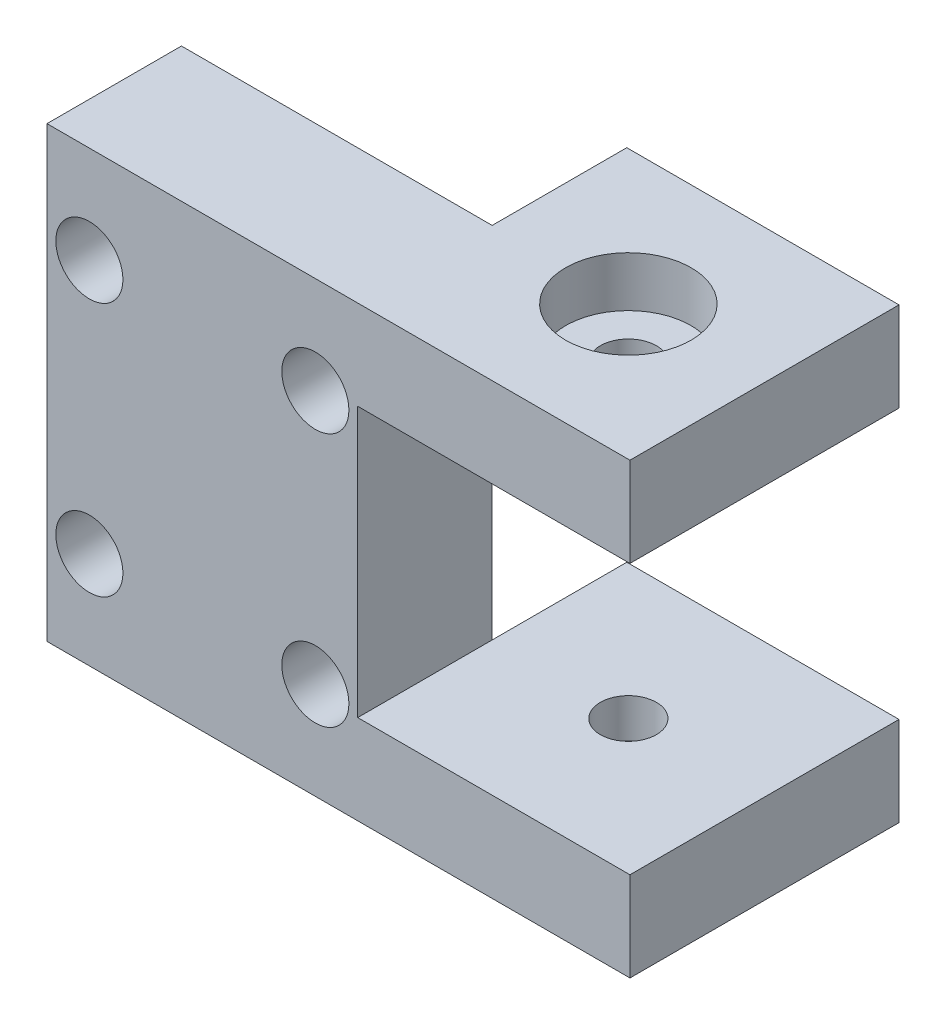
ISO-10303-21;
HEADER;
FILE_DESCRIPTION(('STEP AP214'),'2;1');
FILE_NAME('part.step','',(''),(''),'','','');
FILE_SCHEMA(('AUTOMOTIVE_DESIGN { 1 0 10303 214 1 1 1 1 }'));
ENDSEC;
DATA;
#1=APPLICATION_CONTEXT('core data for automotive mechanical design processes');
#2=APPLICATION_PROTOCOL_DEFINITION('international standard','automotive_design',2000,#1);
#3=PRODUCT_CONTEXT('',#1,'mechanical');
#4=PRODUCT('Part','Part','',(#3));
#5=PRODUCT_RELATED_PRODUCT_CATEGORY('part','',(#4));
#6=PRODUCT_DEFINITION_FORMATION('','',#4);
#7=PRODUCT_DEFINITION_CONTEXT('part definition',#1,'design');
#8=PRODUCT_DEFINITION('design','',#6,#7);
#9=PRODUCT_DEFINITION_SHAPE('','',#8);
#10=(LENGTH_UNIT() NAMED_UNIT(*) SI_UNIT(.MILLI.,.METRE.));
#11=(NAMED_UNIT(*) PLANE_ANGLE_UNIT() SI_UNIT($,.RADIAN.));
#12=(NAMED_UNIT(*) SI_UNIT($,.STERADIAN.) SOLID_ANGLE_UNIT());
#13=UNCERTAINTY_MEASURE_WITH_UNIT(LENGTH_MEASURE(1.E-05),#10,'distance_accuracy_value','');
#14=(GEOMETRIC_REPRESENTATION_CONTEXT(3) GLOBAL_UNCERTAINTY_ASSIGNED_CONTEXT((#13)) GLOBAL_UNIT_ASSIGNED_CONTEXT((#10,
#11,#12)) REPRESENTATION_CONTEXT('',''));
#15=CARTESIAN_POINT('',(0.,0.,0.));
#16=DIRECTION('',(0.,0.,1.));
#17=DIRECTION('',(1.,0.,0.));
#18=AXIS2_PLACEMENT_3D('',#15,#16,#17);
#19=CARTESIAN_POINT('',(-187.450000000001,17.9999999999998,19.038019346602));
#20=DIRECTION('',(0.,0.,-1.));
#21=DIRECTION('',(-1.,0.,0.));
#22=AXIS2_PLACEMENT_3D('',#19,#20,#21);
#23=CYLINDRICAL_SURFACE('',#22,2.65000000000001);
#24=CARTESIAN_POINT('',(-187.45,18.,0.));
#25=DIRECTION('',(0.,0.,1.));
#26=DIRECTION('',(1.,0.,0.));
#27=AXIS2_PLACEMENT_3D('',#24,#25,#26);
#28=CIRCLE('',#27,2.65000000000001);
#29=CARTESIAN_POINT('',(-184.8,18.,0.));
#30=VERTEX_POINT('',#29);
#31=EDGE_CURVE('E423',#30,#30,#28,.T.);
#32=ORIENTED_EDGE('',*,*,#31,.F.);
#33=EDGE_LOOP('',(#32));
#34=FACE_BOUND('',#33,.T.);
#35=CARTESIAN_POINT('',(-187.450000000001,17.9999999999998,6.35000000000006));
#36=DIRECTION('',(0.,0.,1.));
#37=DIRECTION('',(1.,0.,0.));
#38=AXIS2_PLACEMENT_3D('',#35,#36,#37);
#39=CIRCLE('',#38,2.65000000000001);
#40=CARTESIAN_POINT('',(-184.8,17.9999999999998,6.35000000000006));
#41=VERTEX_POINT('',#40);
#42=EDGE_CURVE('E632',#41,#41,#39,.F.);
#43=ORIENTED_EDGE('',*,*,#42,.F.);
#44=EDGE_LOOP('',(#43));
#45=FACE_BOUND('',#44,.T.);
#46=ADVANCED_FACE('F45',(#34,#45),#23,.F.);
#47=CARTESIAN_POINT('',(-155.450000000006,17.9999999999986,19.038019346603));
#48=DIRECTION('',(0.,0.,-1.));
#49=DIRECTION('',(-1.,0.,0.));
#50=AXIS2_PLACEMENT_3D('',#47,#48,#49);
#51=CYLINDRICAL_SURFACE('',#50,2.65000000000001);
#52=CARTESIAN_POINT('',(-155.45,17.9999999999999,0.));
#53=DIRECTION('',(0.,0.,1.));
#54=DIRECTION('',(1.,0.,0.));
#55=AXIS2_PLACEMENT_3D('',#52,#53,#54);
#56=CIRCLE('',#55,2.65000000000001);
#57=CARTESIAN_POINT('',(-152.8,17.9999999999999,0.));
#58=VERTEX_POINT('',#57);
#59=EDGE_CURVE('E421',#58,#58,#56,.T.);
#60=ORIENTED_EDGE('',*,*,#59,.F.);
#61=EDGE_LOOP('',(#60));
#62=FACE_BOUND('',#61,.T.);
#63=CARTESIAN_POINT('',(-155.450000000002,17.9999999999994,6.35000000000033));
#64=DIRECTION('',(0.,0.,1.));
#65=DIRECTION('',(1.,0.,0.));
#66=AXIS2_PLACEMENT_3D('',#63,#64,#65);
#67=CIRCLE('',#66,2.65000000000001);
#68=CARTESIAN_POINT('',(-152.800000000002,17.9999999999994,6.35000000000032));
#69=VERTEX_POINT('',#68);
#70=EDGE_CURVE('E647',#69,#69,#67,.F.);
#71=ORIENTED_EDGE('',*,*,#70,.F.);
#72=EDGE_LOOP('',(#71));
#73=FACE_BOUND('',#72,.T.);
#74=ADVANCED_FACE('F360',(#62,#73),#51,.F.);
#75=CARTESIAN_POINT('',(-155.450000000006,-18.0000000000013,19.0380193466032));
#76=DIRECTION('',(0.,0.,-1.));
#77=DIRECTION('',(-1.,0.,0.));
#78=AXIS2_PLACEMENT_3D('',#75,#76,#77);
#79=CYLINDRICAL_SURFACE('',#78,2.65000000000001);
#80=CARTESIAN_POINT('',(-155.450000000006,-18.0000000000012,6.52256026967279E-13));
#81=DIRECTION('',(0.,0.,1.));
#82=DIRECTION('',(1.,0.,0.));
#83=AXIS2_PLACEMENT_3D('',#80,#81,#82);
#84=CIRCLE('',#83,2.65000000000001);
#85=CARTESIAN_POINT('',(-152.800000000006,-18.0000000000012,6.51814713314991E-13));
#86=VERTEX_POINT('',#85);
#87=EDGE_CURVE('E417',#86,#86,#84,.T.);
#88=ORIENTED_EDGE('',*,*,#87,.F.);
#89=EDGE_LOOP('',(#88));
#90=FACE_BOUND('',#89,.T.);
#91=CARTESIAN_POINT('',(-155.450000000006,-18.0000000000012,6.35000000000091));
#92=DIRECTION('',(0.,0.,1.));
#93=DIRECTION('',(1.,0.,0.));
#94=AXIS2_PLACEMENT_3D('',#91,#92,#93);
#95=CIRCLE('',#94,2.65000000000001);
#96=CARTESIAN_POINT('',(-152.800000000006,-18.0000000000012,6.35000000000091));
#97=VERTEX_POINT('',#96);
#98=EDGE_CURVE('E662',#97,#97,#95,.F.);
#99=ORIENTED_EDGE('',*,*,#98,.F.);
#100=EDGE_LOOP('',(#99));
#101=FACE_BOUND('',#100,.T.);
#102=ADVANCED_FACE('F367',(#90,#101),#79,.F.);
#103=CARTESIAN_POINT('',(-187.450000000001,-18.0000000000002,19.038019346602));
#104=DIRECTION('',(0.,0.,-1.));
#105=DIRECTION('',(-1.,0.,0.));
#106=AXIS2_PLACEMENT_3D('',#103,#104,#105);
#107=CYLINDRICAL_SURFACE('',#106,2.65000000000001);
#108=CARTESIAN_POINT('',(-187.45,-18.,0.));
#109=DIRECTION('',(0.,0.,1.));
#110=DIRECTION('',(1.,0.,0.));
#111=AXIS2_PLACEMENT_3D('',#108,#109,#110);
#112=CIRCLE('',#111,2.65000000000001);
#113=CARTESIAN_POINT('',(-184.8,-18.,0.));
#114=VERTEX_POINT('',#113);
#115=EDGE_CURVE('E413',#114,#114,#112,.T.);
#116=ORIENTED_EDGE('',*,*,#115,.F.);
#117=EDGE_LOOP('',(#116));
#118=FACE_BOUND('',#117,.T.);
#119=CARTESIAN_POINT('',(-187.45,-18.,6.35));
#120=DIRECTION('',(0.,0.,1.));
#121=DIRECTION('',(1.,0.,0.));
#122=AXIS2_PLACEMENT_3D('',#119,#120,#121);
#123=CIRCLE('',#122,2.65000000000001);
#124=CARTESIAN_POINT('',(-184.8,-18.,6.35));
#125=VERTEX_POINT('',#124);
#126=EDGE_CURVE('E649',#125,#125,#123,.F.);
#127=ORIENTED_EDGE('',*,*,#126,.F.);
#128=EDGE_LOOP('',(#127));
#129=FACE_BOUND('',#128,.T.);
#130=ADVANCED_FACE('F374',(#118,#129),#107,.F.);
#131=CARTESIAN_POINT('',(-130.175000000001,-31.7500000000001,-0.0119806533978584));
#132=DIRECTION('',(0.,1.,0.));
#133=DIRECTION('',(0.,0.,1.));
#134=AXIS2_PLACEMENT_3D('',#131,#132,#133);
#135=CYLINDRICAL_SURFACE('',#134,3.96874999999999);
#136=CARTESIAN_POINT('',(-130.175000000001,19.0888193466016,-0.0119806533979607));
#137=DIRECTION('',(0.,1.,0.));
#138=DIRECTION('',(0.,0.,1.));
#139=AXIS2_PLACEMENT_3D('',#136,#137,#138);
#140=CIRCLE('',#139,3.96874999999999);
#141=CARTESIAN_POINT('',(-130.175000000001,19.0888193466016,3.95676934660203));
#142=VERTEX_POINT('',#141);
#143=EDGE_CURVE('E189',#142,#142,#140,.T.);
#144=ORIENTED_EDGE('',*,*,#143,.F.);
#145=EDGE_LOOP('',(#144));
#146=FACE_BOUND('',#145,.T.);
#147=CARTESIAN_POINT('',(-130.175000000001,24.6463393466016,-0.0119806533979572));
#148=DIRECTION('',(0.,1.,0.));
#149=DIRECTION('',(0.,0.,1.));
#150=AXIS2_PLACEMENT_3D('',#147,#148,#149);
#151=CIRCLE('',#150,3.96874999999999);
#152=CARTESIAN_POINT('',(-130.175000000001,24.6463393466016,3.95676934660203));
#153=VERTEX_POINT('',#152);
#154=EDGE_CURVE('E212',#153,#153,#151,.F.);
#155=ORIENTED_EDGE('',*,*,#154,.F.);
#156=EDGE_LOOP('',(#155));
#157=FACE_BOUND('',#156,.T.);
#158=ADVANCED_FACE('F396',(#146,#157),#135,.F.);
#159=CARTESIAN_POINT('',(0.,-31.75,19.0380193466019));
#160=DIRECTION('',(0.,1.,0.));
#161=DIRECTION('',(0.,0.,1.));
#162=AXIS2_PLACEMENT_3D('',#159,#160,#161);
#163=PLANE('',#162);
#164=DIRECTION('',(1.,0.,0.));
#165=VECTOR('',#164,1.);
#166=CARTESIAN_POINT('',(0.,-31.75,0.));
#167=LINE('',#166,#165);
#168=CARTESIAN_POINT('',(-193.450000000001,-31.7500000000001,0.));
#169=VERTEX_POINT('',#168);
#170=CARTESIAN_POINT('',(-149.450000000004,-31.7500000000007,4.77048955893622E-13));
#171=VERTEX_POINT('',#170);
#172=EDGE_CURVE('E167',#169,#171,#167,.T.);
#173=ORIENTED_EDGE('',*,*,#172,.T.);
#174=DIRECTION('',(0.,0.,1.));
#175=VECTOR('',#174,1.);
#176=CARTESIAN_POINT('',(-149.45,-31.75,-97.7379340684195));
#177=LINE('',#176,#175);
#178=CARTESIAN_POINT('',(-149.45,-31.7500000000001,-19.061980653398));
#179=VERTEX_POINT('',#178);
#180=EDGE_CURVE('E63',#179,#171,#177,.T.);
#181=ORIENTED_EDGE('',*,*,#180,.F.);
#182=DIRECTION('',(-1.,0.,0.));
#183=VECTOR('',#182,1.);
#184=CARTESIAN_POINT('',(0.,-31.75,-19.0619806533981));
#185=LINE('',#184,#183);
#186=CARTESIAN_POINT('',(-110.900000000001,-31.7500000000003,-19.061980653398));
#187=VERTEX_POINT('',#186);
#188=EDGE_CURVE('E138',#187,#179,#185,.T.);
#189=ORIENTED_EDGE('',*,*,#188,.F.);
#190=DIRECTION('',(0.,0.,-1.));
#191=VECTOR('',#190,1.);
#192=CARTESIAN_POINT('',(-110.900000000001,-31.7500000000002,19.0380193466022));
#193=LINE('',#192,#191);
#194=CARTESIAN_POINT('',(-110.900000000001,-31.7500000000002,19.0380193466022));
#195=VERTEX_POINT('',#194);
#196=EDGE_CURVE('E132',#195,#187,#193,.T.);
#197=ORIENTED_EDGE('',*,*,#196,.F.);
#198=DIRECTION('',(1.,0.,0.));
#199=VECTOR('',#198,1.);
#200=CARTESIAN_POINT('',(0.,-31.75,19.0380193466019));
#201=LINE('',#200,#199);
#202=CARTESIAN_POINT('',(-193.450000000001,-31.7500000000002,19.038019346602));
#203=VERTEX_POINT('',#202);
#204=EDGE_CURVE('E116',#203,#195,#201,.T.);
#205=ORIENTED_EDGE('',*,*,#204,.F.);
#206=DIRECTION('',(0.,0.,-1.));
#207=VECTOR('',#206,1.);
#208=CARTESIAN_POINT('',(-193.450000000001,-31.7500000000002,19.038019346602));
#209=LINE('',#208,#207);
#210=EDGE_CURVE('E143',#203,#169,#209,.T.);
#211=ORIENTED_EDGE('',*,*,#210,.T.);
#212=EDGE_LOOP('',(#173,#181,#189,#197,#205,#211));
#213=FACE_BOUND('',#212,.T.);
#214=CARTESIAN_POINT('',(-130.175000000001,-31.7500000000001,-0.0119806533978584));
#215=DIRECTION('',(0.,1.,0.));
#216=DIRECTION('',(0.,0.,1.));
#217=AXIS2_PLACEMENT_3D('',#214,#215,#216);
#218=CIRCLE('',#217,8.88999999999999);
#219=CARTESIAN_POINT('',(-130.175000000001,-31.7500000000001,8.87801934660213));
#220=VERTEX_POINT('',#219);
#221=EDGE_CURVE('E49',#220,#220,#218,.F.);
#222=ORIENTED_EDGE('',*,*,#221,.F.);
#223=EDGE_LOOP('',(#222));
#224=FACE_BOUND('',#223,.T.);
#225=ADVANCED_FACE('F134',(#213,#224),#163,.F.);
#226=CARTESIAN_POINT('',(-149.450000000006,-1.35048222604794E-12,19.0380193466033));
#227=DIRECTION('',(1.,0.,0.));
#228=DIRECTION('',(0.,0.,-1.));
#229=AXIS2_PLACEMENT_3D('',#226,#227,#228);
#230=PLANE('',#229);
#231=DIRECTION('',(0.,-1.,0.));
#232=VECTOR('',#231,1.);
#233=CARTESIAN_POINT('',(-149.450000000003,-5.62375666868231E-13,3.20815422838461E-13));
#234=LINE('',#233,#232);
#235=CARTESIAN_POINT('',(-149.450000000006,19.0888193466006,5.41233724504764E-13));
#236=VERTEX_POINT('',#235);
#237=CARTESIAN_POINT('',(-149.450000000004,-19.0888193466026,5.36896915814822E-13));
#238=VERTEX_POINT('',#237);
#239=EDGE_CURVE('E156',#236,#238,#234,.T.);
#240=ORIENTED_EDGE('',*,*,#239,.F.);
#241=DIRECTION('',(0.,0.,-1.));
#242=VECTOR('',#241,1.);
#243=CARTESIAN_POINT('',(-149.450000000001,19.0888193466015,19.0380193466022));
#244=LINE('',#243,#242);
#245=CARTESIAN_POINT('',(-149.450000000001,19.0888193466015,19.0380193466022));
#246=VERTEX_POINT('',#245);
#247=EDGE_CURVE('E12',#246,#236,#244,.T.);
#248=ORIENTED_EDGE('',*,*,#247,.F.);
#249=DIRECTION('',(0.,-1.,0.));
#250=VECTOR('',#249,1.);
#251=CARTESIAN_POINT('',(-149.450000000006,-1.35048222604794E-12,19.0380193466033));
#252=LINE('',#251,#250);
#253=CARTESIAN_POINT('',(-149.450000000006,-19.088819346603,19.0380193466033));
#254=VERTEX_POINT('',#253);
#255=EDGE_CURVE('E170',#246,#254,#252,.T.);
#256=ORIENTED_EDGE('',*,*,#255,.T.);
#257=DIRECTION('',(0.,0.,-1.));
#258=VECTOR('',#257,1.);
#259=CARTESIAN_POINT('',(-149.450000000006,-19.088819346603,19.0380193466033));
#260=LINE('',#259,#258);
#261=EDGE_CURVE('E72',#254,#238,#260,.T.);
#262=ORIENTED_EDGE('',*,*,#261,.T.);
#263=EDGE_LOOP('',(#240,#248,#256,#262));
#264=FACE_BOUND('',#263,.T.);
#265=ADVANCED_FACE('F47',(#264),#230,.T.);
#266=CARTESIAN_POINT('',(0.,19.0888193466018,19.0380193466019));
#267=DIRECTION('',(0.,1.,0.));
#268=DIRECTION('',(0.,0.,1.));
#269=AXIS2_PLACEMENT_3D('',#266,#267,#268);
#270=PLANE('',#269);
#271=ORIENTED_EDGE('',*,*,#143,.T.);
#272=EDGE_LOOP('',(#271));
#273=FACE_BOUND('',#272,.T.);
#274=ORIENTED_EDGE('',*,*,#247,.T.);
#275=DIRECTION('',(0.,0.,1.));
#276=VECTOR('',#275,1.);
#277=CARTESIAN_POINT('',(-149.450000000001,19.0888193466016,-97.7379340684197));
#278=LINE('',#277,#276);
#279=CARTESIAN_POINT('',(-149.450000000003,19.0888193466013,-19.061980653398));
#280=VERTEX_POINT('',#279);
#281=EDGE_CURVE('E235',#280,#236,#278,.T.);
#282=ORIENTED_EDGE('',*,*,#281,.F.);
#283=DIRECTION('',(-1.,0.,0.));
#284=VECTOR('',#283,1.);
#285=CARTESIAN_POINT('',(0.,19.0888193466018,-19.0619806533981));
#286=LINE('',#285,#284);
#287=CARTESIAN_POINT('',(-110.900000000002,19.0888193466015,-19.0619806533981));
#288=VERTEX_POINT('',#287);
#289=EDGE_CURVE('E221',#288,#280,#286,.T.);
#290=ORIENTED_EDGE('',*,*,#289,.F.);
#291=DIRECTION('',(0.,0.,-1.));
#292=VECTOR('',#291,1.);
#293=CARTESIAN_POINT('',(-110.900000000005,19.0888193466006,19.0380193466028));
#294=LINE('',#293,#292);
#295=CARTESIAN_POINT('',(-110.900000000005,19.0888193466006,19.0380193466028));
#296=VERTEX_POINT('',#295);
#297=EDGE_CURVE('E55',#296,#288,#294,.T.);
#298=ORIENTED_EDGE('',*,*,#297,.F.);
#299=DIRECTION('',(1.,0.,0.));
#300=VECTOR('',#299,1.);
#301=CARTESIAN_POINT('',(0.,19.0888193466018,19.0380193466019));
#302=LINE('',#301,#300);
#303=EDGE_CURVE('E265',#246,#296,#302,.T.);
#304=ORIENTED_EDGE('',*,*,#303,.F.);
#305=EDGE_LOOP('',(#274,#282,#290,#298,#304));
#306=FACE_BOUND('',#305,.T.);
#307=ADVANCED_FACE('F320',(#273,#306),#270,.F.);
#308=CARTESIAN_POINT('',(-110.900000000002,4.58660887048268E-12,19.038019346602));
#309=DIRECTION('',(1.,0.,0.));
#310=DIRECTION('',(0.,1.,0.));
#311=AXIS2_PLACEMENT_3D('',#308,#309,#310);
#312=PLANE('',#311);
#313=ORIENTED_EDGE('',*,*,#297,.T.);
#314=DIRECTION('',(0.,1.,0.));
#315=VECTOR('',#314,1.);
#316=CARTESIAN_POINT('',(-110.900000000002,4.45997405673637E-12,-19.0619806533979));
#317=LINE('',#316,#315);
#318=CARTESIAN_POINT('',(-110.9,31.7499999999999,-19.061980653398));
#319=VERTEX_POINT('',#318);
#320=EDGE_CURVE('E161',#288,#319,#317,.T.);
#321=ORIENTED_EDGE('',*,*,#320,.T.);
#322=DIRECTION('',(0.,0.,-1.));
#323=VECTOR('',#322,1.);
#324=CARTESIAN_POINT('',(-110.900000000004,31.7499999999987,19.0380193466028));
#325=LINE('',#324,#323);
#326=CARTESIAN_POINT('',(-110.900000000004,31.7499999999987,19.0380193466028));
#327=VERTEX_POINT('',#326);
#328=EDGE_CURVE('E180',#327,#319,#325,.T.);
#329=ORIENTED_EDGE('',*,*,#328,.F.);
#330=DIRECTION('',(0.,-1.,0.));
#331=VECTOR('',#330,1.);
#332=CARTESIAN_POINT('',(-110.900000000002,4.58660887048268E-12,19.038019346602));
#333=LINE('',#332,#331);
#334=EDGE_CURVE('E268',#327,#296,#333,.T.);
#335=ORIENTED_EDGE('',*,*,#334,.T.);
#336=EDGE_LOOP('',(#313,#321,#329,#335));
#337=FACE_BOUND('',#336,.T.);
#338=ADVANCED_FACE('F309',(#337),#312,.T.);
#339=CARTESIAN_POINT('',(0.,31.75,19.0380193466019));
#340=DIRECTION('',(0.,1.,0.));
#341=DIRECTION('',(0.,0.,1.));
#342=AXIS2_PLACEMENT_3D('',#339,#340,#341);
#343=PLANE('',#342);
#344=CARTESIAN_POINT('',(-130.175000000001,31.7499999999998,-0.0119806533979624));
#345=DIRECTION('',(0.,1.,0.));
#346=DIRECTION('',(0.,0.,1.));
#347=AXIS2_PLACEMENT_3D('',#344,#345,#346);
#348=CIRCLE('',#347,8.88999999999999);
#349=CARTESIAN_POINT('',(-130.175000000001,31.7499999999998,8.87801934660203));
#350=VERTEX_POINT('',#349);
#351=EDGE_CURVE('E425',#350,#350,#348,.T.);
#352=ORIENTED_EDGE('',*,*,#351,.F.);
#353=EDGE_LOOP('',(#352));
#354=FACE_BOUND('',#353,.T.);
#355=DIRECTION('',(1.,0.,0.));
#356=VECTOR('',#355,1.);
#357=CARTESIAN_POINT('',(0.,31.75,0.));
#358=LINE('',#357,#356);
#359=CARTESIAN_POINT('',(-193.450000000001,31.7499999999996,0.));
#360=VERTEX_POINT('',#359);
#361=CARTESIAN_POINT('',(-149.450000000006,31.7499999999986,4.09394740330526E-13));
#362=VERTEX_POINT('',#361);
#363=EDGE_CURVE('E160',#360,#362,#358,.T.);
#364=ORIENTED_EDGE('',*,*,#363,.F.);
#365=DIRECTION('',(0.,0.,-1.));
#366=VECTOR('',#365,1.);
#367=CARTESIAN_POINT('',(-193.450000000001,31.7499999999998,19.0380193466021));
#368=LINE('',#367,#366);
#369=CARTESIAN_POINT('',(-193.450000000001,31.7499999999998,19.0380193466021));
#370=VERTEX_POINT('',#369);
#371=EDGE_CURVE('E177',#370,#360,#368,.T.);
#372=ORIENTED_EDGE('',*,*,#371,.F.);
#373=DIRECTION('',(1.,0.,0.));
#374=VECTOR('',#373,1.);
#375=CARTESIAN_POINT('',(0.,31.75,19.0380193466019));
#376=LINE('',#375,#374);
#377=EDGE_CURVE('E272',#370,#327,#376,.T.);
#378=ORIENTED_EDGE('',*,*,#377,.T.);
#379=ORIENTED_EDGE('',*,*,#328,.T.);
#380=DIRECTION('',(-1.,0.,0.));
#381=VECTOR('',#380,1.);
#382=CARTESIAN_POINT('',(0.,31.75,-19.0619806533981));
#383=LINE('',#382,#381);
#384=CARTESIAN_POINT('',(-149.450000000001,31.7499999999996,-19.061980653398));
#385=VERTEX_POINT('',#384);
#386=EDGE_CURVE('E222',#319,#385,#383,.T.);
#387=ORIENTED_EDGE('',*,*,#386,.T.);
#388=DIRECTION('',(0.,0.,1.));
#389=VECTOR('',#388,1.);
#390=CARTESIAN_POINT('',(-149.45,31.7499999999998,-97.7379340684196));
#391=LINE('',#390,#389);
#392=EDGE_CURVE('E233',#385,#362,#391,.T.);
#393=ORIENTED_EDGE('',*,*,#392,.T.);
#394=EDGE_LOOP('',(#364,#372,#378,#379,#387,#393));
#395=FACE_BOUND('',#394,.T.);
#396=ADVANCED_FACE('F303',(#354,#395),#343,.T.);
#397=CARTESIAN_POINT('',(-193.450000000002,-6.58327559133198E-13,19.0380193466024));
#398=DIRECTION('',(1.,0.,0.));
#399=DIRECTION('',(0.,0.,-1.));
#400=AXIS2_PLACEMENT_3D('',#397,#398,#399);
#401=PLANE('',#400);
#402=DIRECTION('',(0.,-1.,0.));
#403=VECTOR('',#402,1.);
#404=CARTESIAN_POINT('',(-193.45,-1.26634813746307E-13,0.));
#405=LINE('',#404,#403);
#406=EDGE_CURVE('E91',#360,#169,#405,.T.);
#407=ORIENTED_EDGE('',*,*,#406,.T.);
#408=ORIENTED_EDGE('',*,*,#210,.F.);
#409=DIRECTION('',(0.,-1.,0.));
#410=VECTOR('',#409,1.);
#411=CARTESIAN_POINT('',(-193.450000000002,-6.58327559133198E-13,19.0380193466024));
#412=LINE('',#411,#410);
#413=EDGE_CURVE('E126',#370,#203,#412,.T.);
#414=ORIENTED_EDGE('',*,*,#413,.F.);
#415=ORIENTED_EDGE('',*,*,#371,.T.);
#416=EDGE_LOOP('',(#407,#408,#414,#415));
#417=FACE_BOUND('',#416,.T.);
#418=ADVANCED_FACE('F356',(#417),#401,.F.);
#419=CARTESIAN_POINT('',(-110.900000000006,-5.84948756099379E-12,19.0380193466032));
#420=DIRECTION('',(-1.,0.,0.));
#421=DIRECTION('',(0.,-1.,0.));
#422=AXIS2_PLACEMENT_3D('',#419,#420,#421);
#423=PLANE('',#422);
#424=ORIENTED_EDGE('',*,*,#196,.T.);
#425=DIRECTION('',(0.,-1.,0.));
#426=VECTOR('',#425,1.);
#427=CARTESIAN_POINT('',(-110.900000000001,-4.79477568759989E-12,-19.0619806533981));
#428=LINE('',#427,#426);
#429=CARTESIAN_POINT('',(-110.900000000001,-19.088819346602,-19.061980653398));
#430=VERTEX_POINT('',#429);
#431=EDGE_CURVE('E234',#430,#187,#428,.T.);
#432=ORIENTED_EDGE('',*,*,#431,.F.);
#433=DIRECTION('',(0.,0.,-1.));
#434=VECTOR('',#433,1.);
#435=CARTESIAN_POINT('',(-110.900000000002,-19.0888193466023,19.0380193466023));
#436=LINE('',#435,#434);
#437=CARTESIAN_POINT('',(-110.900000000002,-19.0888193466023,19.0380193466023));
#438=VERTEX_POINT('',#437);
#439=EDGE_CURVE('E144',#438,#430,#436,.T.);
#440=ORIENTED_EDGE('',*,*,#439,.F.);
#441=DIRECTION('',(0.,1.,0.));
#442=VECTOR('',#441,1.);
#443=CARTESIAN_POINT('',(-110.900000000006,-5.84948756099379E-12,19.0380193466032));
#444=LINE('',#443,#442);
#445=EDGE_CURVE('E122',#195,#438,#444,.T.);
#446=ORIENTED_EDGE('',*,*,#445,.F.);
#447=EDGE_LOOP('',(#424,#432,#440,#446));
#448=FACE_BOUND('',#447,.T.);
#449=ADVANCED_FACE('F146',(#448),#423,.F.);
#450=CARTESIAN_POINT('',(0.,-19.0888193466018,19.0380193466019));
#451=DIRECTION('',(0.,1.,0.));
#452=DIRECTION('',(0.,0.,1.));
#453=AXIS2_PLACEMENT_3D('',#450,#451,#452);
#454=PLANE('',#453);
#455=CARTESIAN_POINT('',(-130.175000000001,-19.0888193466019,-0.0119806533979953));
#456=DIRECTION('',(0.,1.,0.));
#457=DIRECTION('',(0.,0.,1.));
#458=AXIS2_PLACEMENT_3D('',#455,#456,#457);
#459=CIRCLE('',#458,3.96874999999999);
#460=CARTESIAN_POINT('',(-130.175000000001,-19.0888193466019,3.956769346602));
#461=VERTEX_POINT('',#460);
#462=EDGE_CURVE('E186',#461,#461,#459,.T.);
#463=ORIENTED_EDGE('',*,*,#462,.F.);
#464=EDGE_LOOP('',(#463));
#465=FACE_BOUND('',#464,.T.);
#466=ORIENTED_EDGE('',*,*,#439,.T.);
#467=DIRECTION('',(-1.,0.,0.));
#468=VECTOR('',#467,1.);
#469=CARTESIAN_POINT('',(0.,-19.0888193466019,-19.0619806533981));
#470=LINE('',#469,#468);
#471=CARTESIAN_POINT('',(-149.450000000001,-19.0888193466021,-19.061980653398));
#472=VERTEX_POINT('',#471);
#473=EDGE_CURVE('E244',#430,#472,#470,.T.);
#474=ORIENTED_EDGE('',*,*,#473,.T.);
#475=DIRECTION('',(0.,0.,1.));
#476=VECTOR('',#475,1.);
#477=CARTESIAN_POINT('',(-149.45,-19.0888193466019,-97.7379340684195));
#478=LINE('',#477,#476);
#479=EDGE_CURVE('E256',#472,#238,#478,.T.);
#480=ORIENTED_EDGE('',*,*,#479,.T.);
#481=ORIENTED_EDGE('',*,*,#261,.F.);
#482=DIRECTION('',(1.,0.,0.));
#483=VECTOR('',#482,1.);
#484=CARTESIAN_POINT('',(0.,-19.0888193466018,19.0380193466019));
#485=LINE('',#484,#483);
#486=EDGE_CURVE('E149',#254,#438,#485,.T.);
#487=ORIENTED_EDGE('',*,*,#486,.T.);
#488=EDGE_LOOP('',(#466,#474,#480,#481,#487));
#489=FACE_BOUND('',#488,.T.);
#490=ADVANCED_FACE('F344',(#465,#489),#454,.T.);
#491=CARTESIAN_POINT('',(0.,0.,19.0380193466019));
#492=DIRECTION('',(0.,0.,1.));
#493=DIRECTION('',(1.,0.,0.));
#494=AXIS2_PLACEMENT_3D('',#491,#492,#493);
#495=PLANE('',#494);
#496=CARTESIAN_POINT('',(-187.450000000001,-18.0000000000002,19.038019346602));
#497=DIRECTION('',(0.,0.,1.));
#498=DIRECTION('',(1.,0.,0.));
#499=AXIS2_PLACEMENT_3D('',#496,#497,#498);
#500=CIRCLE('',#499,4.75);
#501=CARTESIAN_POINT('',(-182.700000000001,-18.0000000000002,19.038019346602));
#502=VERTEX_POINT('',#501);
#503=EDGE_CURVE('E655',#502,#502,#500,.T.);
#504=ORIENTED_EDGE('',*,*,#503,.F.);
#505=EDGE_LOOP('',(#504));
#506=FACE_BOUND('',#505,.T.);
#507=CARTESIAN_POINT('',(-155.450000000006,-18.0000000000013,19.0380193466032));
#508=DIRECTION('',(0.,0.,1.));
#509=DIRECTION('',(1.,0.,0.));
#510=AXIS2_PLACEMENT_3D('',#507,#508,#509);
#511=CIRCLE('',#510,4.75);
#512=CARTESIAN_POINT('',(-150.700000000006,-18.0000000000013,19.0380193466032));
#513=VERTEX_POINT('',#512);
#514=EDGE_CURVE('E653',#513,#513,#511,.T.);
#515=ORIENTED_EDGE('',*,*,#514,.F.);
#516=EDGE_LOOP('',(#515));
#517=FACE_BOUND('',#516,.T.);
#518=CARTESIAN_POINT('',(-155.450000000006,17.9999999999986,19.038019346603));
#519=DIRECTION('',(0.,0.,1.));
#520=DIRECTION('',(1.,0.,0.));
#521=AXIS2_PLACEMENT_3D('',#518,#519,#520);
#522=CIRCLE('',#521,4.75);
#523=CARTESIAN_POINT('',(-150.700000000006,17.9999999999986,19.038019346603));
#524=VERTEX_POINT('',#523);
#525=EDGE_CURVE('E666',#524,#524,#522,.T.);
#526=ORIENTED_EDGE('',*,*,#525,.F.);
#527=EDGE_LOOP('',(#526));
#528=FACE_BOUND('',#527,.T.);
#529=CARTESIAN_POINT('',(-187.450000000001,17.9999999999998,19.038019346602));
#530=DIRECTION('',(0.,0.,1.));
#531=DIRECTION('',(1.,0.,0.));
#532=AXIS2_PLACEMENT_3D('',#529,#530,#531);
#533=CIRCLE('',#532,4.75);
#534=CARTESIAN_POINT('',(-182.700000000001,17.9999999999998,19.038019346602));
#535=VERTEX_POINT('',#534);
#536=EDGE_CURVE('E638',#535,#535,#533,.T.);
#537=ORIENTED_EDGE('',*,*,#536,.F.);
#538=EDGE_LOOP('',(#537));
#539=FACE_BOUND('',#538,.T.);
#540=ORIENTED_EDGE('',*,*,#255,.F.);
#541=ORIENTED_EDGE('',*,*,#303,.T.);
#542=ORIENTED_EDGE('',*,*,#334,.F.);
#543=ORIENTED_EDGE('',*,*,#377,.F.);
#544=ORIENTED_EDGE('',*,*,#413,.T.);
#545=ORIENTED_EDGE('',*,*,#204,.T.);
#546=ORIENTED_EDGE('',*,*,#445,.T.);
#547=ORIENTED_EDGE('',*,*,#486,.F.);
#548=EDGE_LOOP('',(#540,#541,#542,#543,#544,#545,#546,#547));
#549=FACE_BOUND('',#548,.T.);
#550=ADVANCED_FACE('F119',(#506,#517,#528,#539,#549),#495,.T.);
#551=CARTESIAN_POINT('',(0.,0.,0.));
#552=DIRECTION('',(0.,0.,1.));
#553=DIRECTION('',(1.,0.,0.));
#554=AXIS2_PLACEMENT_3D('',#551,#552,#553);
#555=PLANE('',#554);
#556=ORIENTED_EDGE('',*,*,#115,.T.);
#557=EDGE_LOOP('',(#556));
#558=FACE_BOUND('',#557,.T.);
#559=ORIENTED_EDGE('',*,*,#87,.T.);
#560=EDGE_LOOP('',(#559));
#561=FACE_BOUND('',#560,.T.);
#562=ORIENTED_EDGE('',*,*,#59,.T.);
#563=EDGE_LOOP('',(#562));
#564=FACE_BOUND('',#563,.T.);
#565=ORIENTED_EDGE('',*,*,#31,.T.);
#566=EDGE_LOOP('',(#565));
#567=FACE_BOUND('',#566,.T.);
#568=ORIENTED_EDGE('',*,*,#363,.T.);
#569=DIRECTION('',(0.,-1.,0.));
#570=VECTOR('',#569,1.);
#571=CARTESIAN_POINT('',(-149.450000000003,-5.62375666868231E-13,3.20815422838461E-13));
#572=LINE('',#571,#570);
#573=EDGE_CURVE('E229',#362,#236,#572,.T.);
#574=ORIENTED_EDGE('',*,*,#573,.T.);
#575=ORIENTED_EDGE('',*,*,#239,.T.);
#576=DIRECTION('',(0.,-1.,0.));
#577=VECTOR('',#576,1.);
#578=CARTESIAN_POINT('',(-149.450000000003,-5.62375666868231E-13,3.20815422838461E-13));
#579=LINE('',#578,#577);
#580=EDGE_CURVE('E196',#238,#171,#579,.T.);
#581=ORIENTED_EDGE('',*,*,#580,.T.);
#582=ORIENTED_EDGE('',*,*,#172,.F.);
#583=ORIENTED_EDGE('',*,*,#406,.F.);
#584=EDGE_LOOP('',(#568,#574,#575,#581,#582,#583));
#585=FACE_BOUND('',#584,.T.);
#586=ADVANCED_FACE('F343',(#558,#561,#564,#567,#585),#555,.F.);
#587=CARTESIAN_POINT('',(-149.45,0.,-97.7379340684196));
#588=DIRECTION('',(-1.,0.,0.));
#589=DIRECTION('',(0.,0.,1.));
#590=AXIS2_PLACEMENT_3D('',#587,#588,#589);
#591=PLANE('',#590);
#592=DIRECTION('',(0.,1.,0.));
#593=VECTOR('',#592,1.);
#594=CARTESIAN_POINT('',(-149.450000000001,-1.99493199737333E-13,-19.061980653398));
#595=LINE('',#594,#593);
#596=EDGE_CURVE('E248',#179,#472,#595,.T.);
#597=ORIENTED_EDGE('',*,*,#596,.F.);
#598=ORIENTED_EDGE('',*,*,#180,.T.);
#599=ORIENTED_EDGE('',*,*,#580,.F.);
#600=ORIENTED_EDGE('',*,*,#479,.F.);
#601=EDGE_LOOP('',(#597,#598,#599,#600));
#602=FACE_BOUND('',#601,.T.);
#603=ADVANCED_FACE('F340',(#602),#591,.T.);
#604=CARTESIAN_POINT('',(0.,0.,-19.0619806533981));
#605=DIRECTION('',(0.,0.,1.));
#606=DIRECTION('',(1.,0.,0.));
#607=AXIS2_PLACEMENT_3D('',#604,#605,#606);
#608=PLANE('',#607);
#609=ORIENTED_EDGE('',*,*,#188,.T.);
#610=ORIENTED_EDGE('',*,*,#596,.T.);
#611=ORIENTED_EDGE('',*,*,#473,.F.);
#612=ORIENTED_EDGE('',*,*,#431,.T.);
#613=EDGE_LOOP('',(#609,#610,#611,#612));
#614=FACE_BOUND('',#613,.T.);
#615=ADVANCED_FACE('F338',(#614),#608,.F.);
#616=CARTESIAN_POINT('',(-149.45,0.,-97.7379340684196));
#617=DIRECTION('',(-1.,0.,0.));
#618=DIRECTION('',(0.,0.,1.));
#619=AXIS2_PLACEMENT_3D('',#616,#617,#618);
#620=PLANE('',#619);
#621=DIRECTION('',(0.,1.,0.));
#622=VECTOR('',#621,1.);
#623=CARTESIAN_POINT('',(-149.450000000001,-1.99493199737333E-13,-19.061980653398));
#624=LINE('',#623,#622);
#625=EDGE_CURVE('E217',#280,#385,#624,.T.);
#626=ORIENTED_EDGE('',*,*,#625,.F.);
#627=ORIENTED_EDGE('',*,*,#281,.T.);
#628=ORIENTED_EDGE('',*,*,#573,.F.);
#629=ORIENTED_EDGE('',*,*,#392,.F.);
#630=EDGE_LOOP('',(#626,#627,#628,#629));
#631=FACE_BOUND('',#630,.T.);
#632=ADVANCED_FACE('F326',(#631),#620,.T.);
#633=CARTESIAN_POINT('',(0.,0.,-19.0619806533981));
#634=DIRECTION('',(0.,0.,1.));
#635=DIRECTION('',(1.,0.,0.));
#636=AXIS2_PLACEMENT_3D('',#633,#634,#635);
#637=PLANE('',#636);
#638=ORIENTED_EDGE('',*,*,#289,.T.);
#639=ORIENTED_EDGE('',*,*,#625,.T.);
#640=ORIENTED_EDGE('',*,*,#386,.F.);
#641=ORIENTED_EDGE('',*,*,#320,.F.);
#642=EDGE_LOOP('',(#638,#639,#640,#641));
#643=FACE_BOUND('',#642,.T.);
#644=ADVANCED_FACE('F315',(#643),#637,.F.);
#645=CARTESIAN_POINT('',(-130.175000000002,-24.6463393466021,-0.0119806533979012));
#646=DIRECTION('',(0.,1.,0.));
#647=DIRECTION('',(0.,0.,1.));
#648=AXIS2_PLACEMENT_3D('',#645,#646,#647);
#649=CIRCLE('',#648,3.96874999999999);
#650=CARTESIAN_POINT('',(-130.175000000002,-24.6463393466021,3.95676934660209));
#651=VERTEX_POINT('',#650);
#652=EDGE_CURVE('E205',#651,#651,#649,.T.);
#653=ORIENTED_EDGE('',*,*,#652,.F.);
#654=EDGE_LOOP('',(#653));
#655=FACE_BOUND('',#654,.T.);
#656=ORIENTED_EDGE('',*,*,#462,.T.);
#657=EDGE_LOOP('',(#656));
#658=FACE_BOUND('',#657,.T.);
#659=ADVANCED_FACE('F392',(#655,#658),#135,.F.);
#660=CARTESIAN_POINT('',(-130.175000000001,6.05589779239152,-0.0119806533979624));
#661=DIRECTION('',(0.,-1.,0.));
#662=DIRECTION('',(0.,0.,-1.));
#663=AXIS2_PLACEMENT_3D('',#660,#661,#662);
#664=CYLINDRICAL_SURFACE('',#663,8.88999999999999);
#665=CARTESIAN_POINT('',(-130.175000000002,-24.6463393466021,-0.0119806533979012));
#666=DIRECTION('',(0.,1.,0.));
#667=DIRECTION('',(0.,0.,1.));
#668=AXIS2_PLACEMENT_3D('',#665,#666,#667);
#669=CIRCLE('',#668,8.88999999999999);
#670=CARTESIAN_POINT('',(-130.175000000002,-24.6463393466021,8.87801934660209));
#671=VERTEX_POINT('',#670);
#672=EDGE_CURVE('E199',#671,#671,#669,.T.);
#673=ORIENTED_EDGE('',*,*,#672,.T.);
#674=EDGE_LOOP('',(#673));
#675=FACE_BOUND('',#674,.T.);
#676=ORIENTED_EDGE('',*,*,#221,.T.);
#677=EDGE_LOOP('',(#676));
#678=FACE_BOUND('',#677,.T.);
#679=ADVANCED_FACE('F388',(#675,#678),#664,.F.);
#680=CARTESIAN_POINT('',(0.,-24.6463393466018,19.0380193466019));
#681=DIRECTION('',(0.,1.,0.));
#682=DIRECTION('',(0.,0.,1.));
#683=AXIS2_PLACEMENT_3D('',#680,#681,#682);
#684=PLANE('',#683);
#685=ORIENTED_EDGE('',*,*,#652,.T.);
#686=EDGE_LOOP('',(#685));
#687=FACE_BOUND('',#686,.T.);
#688=ORIENTED_EDGE('',*,*,#672,.F.);
#689=EDGE_LOOP('',(#688));
#690=FACE_BOUND('',#689,.T.);
#691=ADVANCED_FACE('F384',(#687,#690),#684,.F.);
#692=CARTESIAN_POINT('',(-130.175,-6.05589779239175,-0.0119806533980579));
#693=DIRECTION('',(0.,1.,0.));
#694=DIRECTION('',(0.,0.,1.));
#695=AXIS2_PLACEMENT_3D('',#692,#693,#694);
#696=CYLINDRICAL_SURFACE('',#695,8.88999999999999);
#697=CARTESIAN_POINT('',(-130.175000000001,24.6463393466016,-0.0119806533979572));
#698=DIRECTION('',(0.,1.,0.));
#699=DIRECTION('',(0.,0.,1.));
#700=AXIS2_PLACEMENT_3D('',#697,#698,#699);
#701=CIRCLE('',#700,8.88999999999999);
#702=CARTESIAN_POINT('',(-130.175000000001,24.6463393466016,8.87801934660203));
#703=VERTEX_POINT('',#702);
#704=EDGE_CURVE('E431',#703,#703,#701,.F.);
#705=ORIENTED_EDGE('',*,*,#704,.T.);
#706=EDGE_LOOP('',(#705));
#707=FACE_BOUND('',#706,.T.);
#708=ORIENTED_EDGE('',*,*,#351,.T.);
#709=EDGE_LOOP('',(#708));
#710=FACE_BOUND('',#709,.T.);
#711=ADVANCED_FACE('F380',(#707,#710),#696,.F.);
#712=CARTESIAN_POINT('',(0.,24.6463393466016,19.0380193466021));
#713=DIRECTION('',(0.,1.,0.));
#714=DIRECTION('',(0.,0.,1.));
#715=AXIS2_PLACEMENT_3D('',#712,#713,#714);
#716=PLANE('',#715);
#717=ORIENTED_EDGE('',*,*,#704,.F.);
#718=EDGE_LOOP('',(#717));
#719=FACE_BOUND('',#718,.T.);
#720=ORIENTED_EDGE('',*,*,#154,.T.);
#721=EDGE_LOOP('',(#720));
#722=FACE_BOUND('',#721,.T.);
#723=ADVANCED_FACE('F376',(#719,#722),#716,.T.);
#724=CARTESIAN_POINT('',(-187.45,-18.,-13.4350288425444));
#725=DIRECTION('',(0.,0.,1.));
#726=DIRECTION('',(1.,0.,0.));
#727=AXIS2_PLACEMENT_3D('',#724,#725,#726);
#728=CYLINDRICAL_SURFACE('',#727,4.75);
#729=CARTESIAN_POINT('',(-187.45,-18.,6.35));
#730=DIRECTION('',(0.,0.,1.));
#731=DIRECTION('',(1.,0.,0.));
#732=AXIS2_PLACEMENT_3D('',#729,#730,#731);
#733=CIRCLE('',#732,4.75);
#734=CARTESIAN_POINT('',(-182.7,-18.,6.35));
#735=VERTEX_POINT('',#734);
#736=EDGE_CURVE('E654',#735,#735,#733,.F.);
#737=ORIENTED_EDGE('',*,*,#736,.T.);
#738=EDGE_LOOP('',(#737));
#739=FACE_BOUND('',#738,.T.);
#740=ORIENTED_EDGE('',*,*,#503,.T.);
#741=EDGE_LOOP('',(#740));
#742=FACE_BOUND('',#741,.T.);
#743=ADVANCED_FACE('F379',(#739,#742),#728,.F.);
#744=CARTESIAN_POINT('',(0.,0.,6.34999999999999));
#745=DIRECTION('',(0.,0.,1.));
#746=DIRECTION('',(1.,0.,0.));
#747=AXIS2_PLACEMENT_3D('',#744,#745,#746);
#748=PLANE('',#747);
#749=ORIENTED_EDGE('',*,*,#736,.F.);
#750=EDGE_LOOP('',(#749));
#751=FACE_BOUND('',#750,.T.);
#752=ORIENTED_EDGE('',*,*,#126,.T.);
#753=EDGE_LOOP('',(#752));
#754=FACE_BOUND('',#753,.T.);
#755=ADVANCED_FACE('F568',(#751,#754),#748,.T.);
#756=CARTESIAN_POINT('',(-155.45,-18.0000000000001,-13.4350288425444));
#757=DIRECTION('',(0.,0.,1.));
#758=DIRECTION('',(1.,0.,0.));
#759=AXIS2_PLACEMENT_3D('',#756,#757,#758);
#760=CYLINDRICAL_SURFACE('',#759,4.75);
#761=CARTESIAN_POINT('',(-155.450000000006,-18.0000000000012,6.35000000000091));
#762=DIRECTION('',(0.,0.,1.));
#763=DIRECTION('',(1.,0.,0.));
#764=AXIS2_PLACEMENT_3D('',#761,#762,#763);
#765=CIRCLE('',#764,4.75);
#766=CARTESIAN_POINT('',(-150.700000000006,-18.0000000000012,6.35000000000091));
#767=VERTEX_POINT('',#766);
#768=EDGE_CURVE('E667',#767,#767,#765,.F.);
#769=ORIENTED_EDGE('',*,*,#768,.T.);
#770=EDGE_LOOP('',(#769));
#771=FACE_BOUND('',#770,.T.);
#772=ORIENTED_EDGE('',*,*,#514,.T.);
#773=EDGE_LOOP('',(#772));
#774=FACE_BOUND('',#773,.T.);
#775=ADVANCED_FACE('F576',(#771,#774),#760,.F.);
#776=CARTESIAN_POINT('',(0.,0.,6.34999999999999));
#777=DIRECTION('',(0.,0.,1.));
#778=DIRECTION('',(1.,0.,0.));
#779=AXIS2_PLACEMENT_3D('',#776,#777,#778);
#780=PLANE('',#779);
#781=ORIENTED_EDGE('',*,*,#768,.F.);
#782=EDGE_LOOP('',(#781));
#783=FACE_BOUND('',#782,.T.);
#784=ORIENTED_EDGE('',*,*,#98,.T.);
#785=EDGE_LOOP('',(#784));
#786=FACE_BOUND('',#785,.T.);
#787=ADVANCED_FACE('F584',(#783,#786),#780,.T.);
#788=CARTESIAN_POINT('',(-155.450000000001,17.9999999999999,-13.4350288425444));
#789=DIRECTION('',(0.,0.,1.));
#790=DIRECTION('',(1.,0.,0.));
#791=AXIS2_PLACEMENT_3D('',#788,#789,#790);
#792=CYLINDRICAL_SURFACE('',#791,4.75);
#793=CARTESIAN_POINT('',(-155.450000000002,17.9999999999994,6.35000000000033));
#794=DIRECTION('',(0.,0.,1.));
#795=DIRECTION('',(1.,0.,0.));
#796=AXIS2_PLACEMENT_3D('',#793,#794,#795);
#797=CIRCLE('',#796,4.75);
#798=CARTESIAN_POINT('',(-150.700000000002,17.9999999999994,6.35000000000032));
#799=VERTEX_POINT('',#798);
#800=EDGE_CURVE('E677',#799,#799,#797,.F.);
#801=ORIENTED_EDGE('',*,*,#800,.T.);
#802=EDGE_LOOP('',(#801));
#803=FACE_BOUND('',#802,.T.);
#804=ORIENTED_EDGE('',*,*,#525,.T.);
#805=EDGE_LOOP('',(#804));
#806=FACE_BOUND('',#805,.T.);
#807=ADVANCED_FACE('F592',(#803,#806),#792,.F.);
#808=CARTESIAN_POINT('',(0.,0.,6.34999999999999));
#809=DIRECTION('',(0.,0.,1.));
#810=DIRECTION('',(1.,0.,0.));
#811=AXIS2_PLACEMENT_3D('',#808,#809,#810);
#812=PLANE('',#811);
#813=ORIENTED_EDGE('',*,*,#800,.F.);
#814=EDGE_LOOP('',(#813));
#815=FACE_BOUND('',#814,.T.);
#816=ORIENTED_EDGE('',*,*,#70,.T.);
#817=EDGE_LOOP('',(#816));
#818=FACE_BOUND('',#817,.T.);
#819=ADVANCED_FACE('F600',(#815,#818),#812,.T.);
#820=CARTESIAN_POINT('',(-187.450000000002,17.9999999999995,-13.4350288425442));
#821=DIRECTION('',(0.,0.,1.));
#822=DIRECTION('',(1.,0.,0.));
#823=AXIS2_PLACEMENT_3D('',#820,#821,#822);
#824=CYLINDRICAL_SURFACE('',#823,4.75);
#825=CARTESIAN_POINT('',(-187.450000000001,17.9999999999998,6.35000000000006));
#826=DIRECTION('',(0.,0.,1.));
#827=DIRECTION('',(1.,0.,0.));
#828=AXIS2_PLACEMENT_3D('',#825,#826,#827);
#829=CIRCLE('',#828,4.75);
#830=CARTESIAN_POINT('',(-182.700000000001,17.9999999999998,6.35000000000006));
#831=VERTEX_POINT('',#830);
#832=EDGE_CURVE('E629',#831,#831,#829,.F.);
#833=ORIENTED_EDGE('',*,*,#832,.T.);
#834=EDGE_LOOP('',(#833));
#835=FACE_BOUND('',#834,.T.);
#836=ORIENTED_EDGE('',*,*,#536,.T.);
#837=EDGE_LOOP('',(#836));
#838=FACE_BOUND('',#837,.T.);
#839=ADVANCED_FACE('F608',(#835,#838),#824,.F.);
#840=CARTESIAN_POINT('',(0.,0.,6.34999999999999));
#841=DIRECTION('',(0.,0.,1.));
#842=DIRECTION('',(1.,0.,0.));
#843=AXIS2_PLACEMENT_3D('',#840,#841,#842);
#844=PLANE('',#843);
#845=ORIENTED_EDGE('',*,*,#832,.F.);
#846=EDGE_LOOP('',(#845));
#847=FACE_BOUND('',#846,.T.);
#848=ORIENTED_EDGE('',*,*,#42,.T.);
#849=EDGE_LOOP('',(#848));
#850=FACE_BOUND('',#849,.T.);
#851=ADVANCED_FACE('F616',(#847,#850),#844,.T.);
#852=CLOSED_SHELL('',(#46,#74,#102,#130,#158,#225,#265,#307,#338,#396,#418,#449,#490,#550,#586,
#603,#615,#632,#644,#659,#679,#691,#711,#723,#743,#755,#775,#787,#807,#819,#839,#851));
#853=MANIFOLD_SOLID_BREP('B2',#852);
#854=ADVANCED_BREP_SHAPE_REPRESENTATION('',(#18,#853),#14);
#855=SHAPE_DEFINITION_REPRESENTATION(#9,#854);
ENDSEC;
END-ISO-10303-21;
